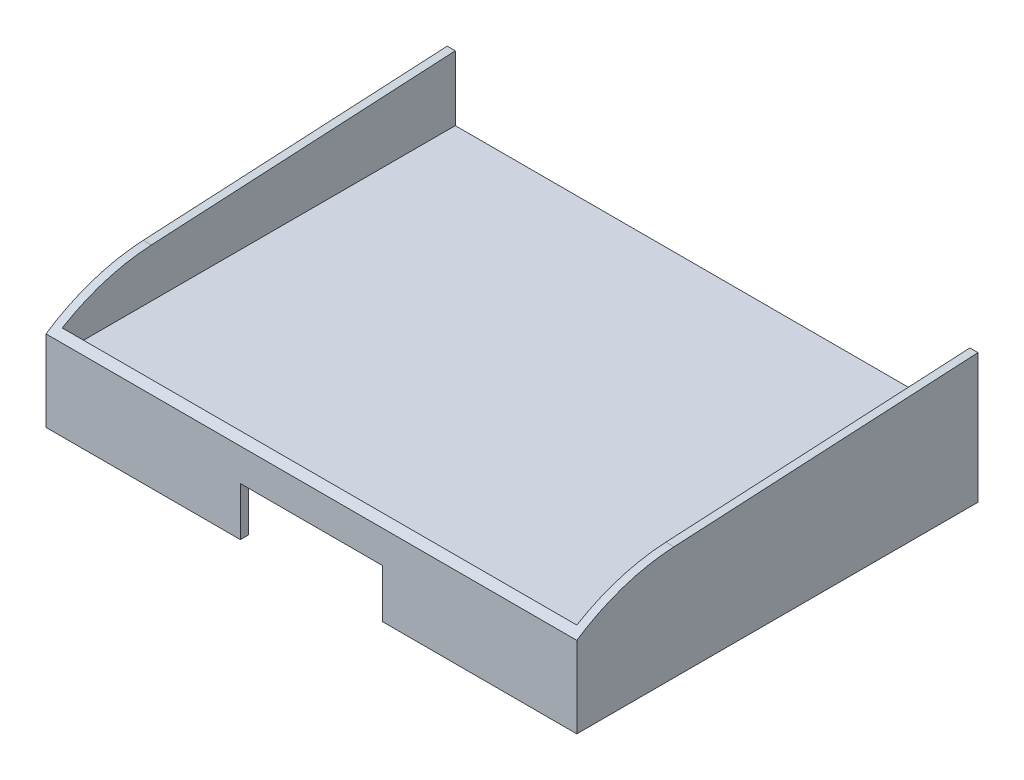
ISO-10303-21;
HEADER;
FILE_DESCRIPTION(('STEP AP214'),'2;1');
FILE_NAME('part.step','',(''),(''),'','','');
FILE_SCHEMA(('AUTOMOTIVE_DESIGN { 1 0 10303 214 1 1 1 1 }'));
ENDSEC;
DATA;
#1=APPLICATION_CONTEXT('core data for automotive mechanical design processes');
#2=APPLICATION_PROTOCOL_DEFINITION('international standard','automotive_design',2000,#1);
#3=PRODUCT_CONTEXT('',#1,'mechanical');
#4=PRODUCT('Part','Part','',(#3));
#5=PRODUCT_RELATED_PRODUCT_CATEGORY('part','',(#4));
#6=PRODUCT_DEFINITION_FORMATION('','',#4);
#7=PRODUCT_DEFINITION_CONTEXT('part definition',#1,'design');
#8=PRODUCT_DEFINITION('design','',#6,#7);
#9=PRODUCT_DEFINITION_SHAPE('','',#8);
#10=(LENGTH_UNIT() NAMED_UNIT(*) SI_UNIT(.MILLI.,.METRE.));
#11=(NAMED_UNIT(*) PLANE_ANGLE_UNIT() SI_UNIT($,.RADIAN.));
#12=(NAMED_UNIT(*) SI_UNIT($,.STERADIAN.) SOLID_ANGLE_UNIT());
#13=UNCERTAINTY_MEASURE_WITH_UNIT(LENGTH_MEASURE(1.E-05),#10,'distance_accuracy_value','');
#14=(GEOMETRIC_REPRESENTATION_CONTEXT(3) GLOBAL_UNCERTAINTY_ASSIGNED_CONTEXT((#13)) GLOBAL_UNIT_ASSIGNED_CONTEXT((#10,
#11,#12)) REPRESENTATION_CONTEXT('',''));
#15=CARTESIAN_POINT('',(0.,0.,0.));
#16=DIRECTION('',(0.,0.,1.));
#17=DIRECTION('',(1.,0.,0.));
#18=AXIS2_PLACEMENT_3D('',#15,#16,#17);
#19=CARTESIAN_POINT('',(242.216999999991,0.,135.763000000025));
#20=DIRECTION('',(1.,0.,0.));
#21=DIRECTION('',(0.,0.,-1.));
#22=AXIS2_PLACEMENT_3D('',#19,#20,#21);
#23=PLANE('',#22);
#24=DIRECTION('',(0.,0.,1.));
#25=VECTOR('',#24,1.);
#26=CARTESIAN_POINT('',(242.216999999991,38.1,-575.946873630957));
#27=LINE('',#26,#25);
#28=CARTESIAN_POINT('',(242.216999999991,38.1,-172.366999999975));
#29=VERTEX_POINT('',#28);
#30=CARTESIAN_POINT('',(242.216999999991,38.1,135.763000000025));
#31=VERTEX_POINT('',#30);
#32=EDGE_CURVE('E163',#29,#31,#27,.T.);
#33=ORIENTED_EDGE('',*,*,#32,.F.);
#34=DIRECTION('',(0.,1.,0.));
#35=VECTOR('',#34,1.);
#36=CARTESIAN_POINT('',(242.216999999991,0.,-172.366999999975));
#37=LINE('',#36,#35);
#38=CARTESIAN_POINT('',(242.216999999991,0.,-172.366999999975));
#39=VERTEX_POINT('',#38);
#40=EDGE_CURVE('E207',#39,#29,#37,.T.);
#41=ORIENTED_EDGE('',*,*,#40,.F.);
#42=DIRECTION('',(0.,0.,-1.));
#43=VECTOR('',#42,1.);
#44=CARTESIAN_POINT('',(242.216999999991,0.,135.763000000025));
#45=LINE('',#44,#43);
#46=CARTESIAN_POINT('',(242.216999999991,0.,135.763000000025));
#47=VERTEX_POINT('',#46);
#48=EDGE_CURVE('E188',#47,#39,#45,.T.);
#49=ORIENTED_EDGE('',*,*,#48,.F.);
#50=DIRECTION('',(0.,1.,0.));
#51=VECTOR('',#50,1.);
#52=CARTESIAN_POINT('',(242.216999999991,0.,135.763000000025));
#53=LINE('',#52,#51);
#54=EDGE_CURVE('E181',#47,#31,#53,.T.);
#55=ORIENTED_EDGE('',*,*,#54,.T.);
#56=EDGE_LOOP('',(#33,#41,#49,#55));
#57=FACE_BOUND('',#56,.T.);
#58=ADVANCED_FACE('F39',(#57),#23,.F.);
#59=DIRECTION('',(0.,0.,1.));
#60=VECTOR('',#59,1.);
#61=CARTESIAN_POINT('',(242.216999999991,50.8,-575.946873630957));
#62=LINE('',#61,#60);
#63=CARTESIAN_POINT('',(242.216999999991,50.8,-172.366999999975));
#64=VERTEX_POINT('',#63);
#65=CARTESIAN_POINT('',(242.216999999991,50.8,135.763000000025));
#66=VERTEX_POINT('',#65);
#67=EDGE_CURVE('E317',#64,#66,#62,.T.);
#68=ORIENTED_EDGE('',*,*,#67,.T.);
#69=CARTESIAN_POINT('',(242.216999999991,67.5291655997989,135.763000000025));
#70=VERTEX_POINT('',#69);
#71=EDGE_CURVE('E190',#66,#70,#53,.T.);
#72=ORIENTED_EDGE('',*,*,#71,.T.);
#73=CARTESIAN_POINT('',(242.216999999991,-62.2717454291141,57.8557515236538));
#74=DIRECTION('',(1.,0.,0.));
#75=DIRECTION('',(0.,0.,-1.));
#76=AXIS2_PLACEMENT_3D('',#73,#74,#75);
#77=CIRCLE('',#76,151.386313347987);
#78=CARTESIAN_POINT('',(242.216999999991,88.9,65.9130000000251));
#79=VERTEX_POINT('',#78);
#80=EDGE_CURVE('E285',#79,#70,#77,.T.);
#81=ORIENTED_EDGE('',*,*,#80,.F.);
#82=DIRECTION('',(0.,-0.0532230972416268,0.998582646514553));
#83=VECTOR('',#82,1.);
#84=CARTESIAN_POINT('',(242.216999999991,84.9358089989365,140.289963128641));
#85=LINE('',#84,#83);
#86=CARTESIAN_POINT('',(242.216999999991,101.6,-172.366999999975));
#87=VERTEX_POINT('',#86);
#88=EDGE_CURVE('E280',#87,#79,#85,.T.);
#89=ORIENTED_EDGE('',*,*,#88,.F.);
#90=EDGE_CURVE('E209',#64,#87,#37,.T.);
#91=ORIENTED_EDGE('',*,*,#90,.F.);
#92=EDGE_LOOP('',(#68,#72,#81,#89,#91));
#93=FACE_BOUND('',#92,.T.);
#94=ADVANCED_FACE('F304',(#93),#23,.F.);
#95=CARTESIAN_POINT('',(-161.163000000009,0.,135.763000000025));
#96=DIRECTION('',(0.,0.,1.));
#97=DIRECTION('',(1.,0.,0.));
#98=AXIS2_PLACEMENT_3D('',#95,#96,#97);
#99=PLANE('',#98);
#100=DIRECTION('',(-1.,0.,0.));
#101=VECTOR('',#100,1.);
#102=CARTESIAN_POINT('',(242.216999999991,38.1,135.763000000025));
#103=LINE('',#102,#101);
#104=CARTESIAN_POINT('',(96.166999999991,38.1,135.763000000025));
#105=VERTEX_POINT('',#104);
#106=EDGE_CURVE('E167',#31,#105,#103,.T.);
#107=ORIENTED_EDGE('',*,*,#106,.F.);
#108=ORIENTED_EDGE('',*,*,#54,.F.);
#109=DIRECTION('',(1.,0.,0.));
#110=VECTOR('',#109,1.);
#111=CARTESIAN_POINT('',(-161.163000000009,0.,135.763000000025));
#112=LINE('',#111,#110);
#113=CARTESIAN_POINT('',(96.166999999991,0.,135.763000000025));
#114=VERTEX_POINT('',#113);
#115=EDGE_CURVE('E289',#114,#47,#112,.T.);
#116=ORIENTED_EDGE('',*,*,#115,.F.);
#117=DIRECTION('',(0.,-1.,0.));
#118=VECTOR('',#117,1.);
#119=CARTESIAN_POINT('',(96.166999999991,0.,135.763000000025));
#120=LINE('',#119,#118);
#121=EDGE_CURVE('E183',#105,#114,#120,.T.);
#122=ORIENTED_EDGE('',*,*,#121,.F.);
#123=EDGE_LOOP('',(#107,#108,#116,#122));
#124=FACE_BOUND('',#123,.T.);
#125=ADVANCED_FACE('F179',(#124),#99,.F.);
#126=CARTESIAN_POINT('',(-15.1130000000088,38.1,135.763000000025));
#127=VERTEX_POINT('',#126);
#128=CARTESIAN_POINT('',(-161.163000000009,38.1,135.763000000025));
#129=VERTEX_POINT('',#128);
#130=EDGE_CURVE('E185',#127,#129,#103,.T.);
#131=ORIENTED_EDGE('',*,*,#130,.F.);
#132=DIRECTION('',(0.,1.,0.));
#133=VECTOR('',#132,1.);
#134=CARTESIAN_POINT('',(-15.1130000000088,0.,135.763000000025));
#135=LINE('',#134,#133);
#136=CARTESIAN_POINT('',(-15.1130000000088,0.,135.763000000025));
#137=VERTEX_POINT('',#136);
#138=EDGE_CURVE('E325',#137,#127,#135,.T.);
#139=ORIENTED_EDGE('',*,*,#138,.F.);
#140=CARTESIAN_POINT('',(-161.163000000009,0.,135.763000000025));
#141=VERTEX_POINT('',#140);
#142=EDGE_CURVE('E198',#141,#137,#112,.T.);
#143=ORIENTED_EDGE('',*,*,#142,.F.);
#144=DIRECTION('',(0.,1.,0.));
#145=VECTOR('',#144,1.);
#146=CARTESIAN_POINT('',(-161.163000000009,0.,135.763000000025));
#147=LINE('',#146,#145);
#148=EDGE_CURVE('E195',#141,#129,#147,.T.);
#149=ORIENTED_EDGE('',*,*,#148,.T.);
#150=EDGE_LOOP('',(#131,#139,#143,#149));
#151=FACE_BOUND('',#150,.T.);
#152=ADVANCED_FACE('F352',(#151),#99,.F.);
#153=DIRECTION('',(1.,0.,0.));
#154=VECTOR('',#153,1.);
#155=CARTESIAN_POINT('',(242.216999999991,50.8,135.763000000025));
#156=LINE('',#155,#154);
#157=CARTESIAN_POINT('',(-161.163000000009,50.8,135.763000000025));
#158=VERTEX_POINT('',#157);
#159=EDGE_CURVE('E184',#158,#66,#156,.T.);
#160=ORIENTED_EDGE('',*,*,#159,.F.);
#161=CARTESIAN_POINT('',(-161.163000000009,67.5291655997989,135.763000000025));
#162=VERTEX_POINT('',#161);
#163=EDGE_CURVE('E202',#158,#162,#147,.T.);
#164=ORIENTED_EDGE('',*,*,#163,.T.);
#165=DIRECTION('',(1.,0.,0.));
#166=VECTOR('',#165,1.);
#167=CARTESIAN_POINT('',(-167.513000000009,67.5291655997989,135.763000000025));
#168=LINE('',#167,#166);
#169=EDGE_CURVE('E282',#70,#162,#168,.F.);
#170=ORIENTED_EDGE('',*,*,#169,.F.);
#171=ORIENTED_EDGE('',*,*,#71,.F.);
#172=EDGE_LOOP('',(#160,#164,#170,#171));
#173=FACE_BOUND('',#172,.T.);
#174=ADVANCED_FACE('F311',(#173),#99,.F.);
#175=CARTESIAN_POINT('',(-161.163000000009,0.,135.763000000025));
#176=DIRECTION('',(-1.,0.,0.));
#177=DIRECTION('',(0.,0.,1.));
#178=AXIS2_PLACEMENT_3D('',#175,#176,#177);
#179=PLANE('',#178);
#180=DIRECTION('',(0.,0.,1.));
#181=VECTOR('',#180,1.);
#182=CARTESIAN_POINT('',(-161.163000000009,38.1,-575.946873630957));
#183=LINE('',#182,#181);
#184=CARTESIAN_POINT('',(-161.163000000009,38.1,-172.366999999975));
#185=VERTEX_POINT('',#184);
#186=EDGE_CURVE('E174',#185,#129,#183,.T.);
#187=ORIENTED_EDGE('',*,*,#186,.T.);
#188=ORIENTED_EDGE('',*,*,#148,.F.);
#189=DIRECTION('',(0.,0.,1.));
#190=VECTOR('',#189,1.);
#191=CARTESIAN_POINT('',(-161.163000000009,0.,135.763000000025));
#192=LINE('',#191,#190);
#193=CARTESIAN_POINT('',(-161.163000000009,0.,-172.366999999975));
#194=VERTEX_POINT('',#193);
#195=EDGE_CURVE('E288',#194,#141,#192,.T.);
#196=ORIENTED_EDGE('',*,*,#195,.F.);
#197=DIRECTION('',(0.,1.,0.));
#198=VECTOR('',#197,1.);
#199=CARTESIAN_POINT('',(-161.163000000009,0.,-172.366999999975));
#200=LINE('',#199,#198);
#201=EDGE_CURVE('E203',#194,#185,#200,.T.);
#202=ORIENTED_EDGE('',*,*,#201,.T.);
#203=EDGE_LOOP('',(#187,#188,#196,#202));
#204=FACE_BOUND('',#203,.T.);
#205=ADVANCED_FACE('F350',(#204),#179,.F.);
#206=DIRECTION('',(0.,0.,1.));
#207=VECTOR('',#206,1.);
#208=CARTESIAN_POINT('',(-161.163000000009,50.8,-575.946873630957));
#209=LINE('',#208,#207);
#210=CARTESIAN_POINT('',(-161.163000000009,50.8,-172.366999999975));
#211=VERTEX_POINT('',#210);
#212=EDGE_CURVE('E315',#211,#158,#209,.T.);
#213=ORIENTED_EDGE('',*,*,#212,.F.);
#214=CARTESIAN_POINT('',(-161.163000000009,101.6,-172.366999999975));
#215=VERTEX_POINT('',#214);
#216=EDGE_CURVE('E206',#211,#215,#200,.T.);
#217=ORIENTED_EDGE('',*,*,#216,.T.);
#218=DIRECTION('',(0.,0.0532230972416268,-0.998582646514553));
#219=VECTOR('',#218,1.);
#220=CARTESIAN_POINT('',(-161.163000000009,84.9358089989365,140.289963128641));
#221=LINE('',#220,#219);
#222=CARTESIAN_POINT('',(-161.163000000009,88.9,65.9130000000251));
#223=VERTEX_POINT('',#222);
#224=EDGE_CURVE('E47',#223,#215,#221,.T.);
#225=ORIENTED_EDGE('',*,*,#224,.F.);
#226=CARTESIAN_POINT('',(-161.163000000009,-62.2717454291141,57.8557515236538));
#227=DIRECTION('',(-1.,0.,0.));
#228=DIRECTION('',(0.,0.,1.));
#229=AXIS2_PLACEMENT_3D('',#226,#227,#228);
#230=CIRCLE('',#229,151.386313347987);
#231=EDGE_CURVE('E11',#162,#223,#230,.T.);
#232=ORIENTED_EDGE('',*,*,#231,.F.);
#233=ORIENTED_EDGE('',*,*,#163,.F.);
#234=EDGE_LOOP('',(#213,#217,#225,#232,#233));
#235=FACE_BOUND('',#234,.T.);
#236=ADVANCED_FACE('F314',(#235),#179,.F.);
#237=CARTESIAN_POINT('',(0.,0.,0.));
#238=DIRECTION('',(0.,-1.,0.));
#239=DIRECTION('',(0.,0.,-1.));
#240=AXIS2_PLACEMENT_3D('',#237,#238,#239);
#241=PLANE('',#240);
#242=DIRECTION('',(0.,0.,1.));
#243=VECTOR('',#242,1.);
#244=CARTESIAN_POINT('',(96.166999999991,0.,-172.367999999975));
#245=LINE('',#244,#243);
#246=CARTESIAN_POINT('',(96.166999999991,0.,142.113000000025));
#247=VERTEX_POINT('',#246);
#248=EDGE_CURVE('E276',#114,#247,#245,.T.);
#249=ORIENTED_EDGE('',*,*,#248,.F.);
#250=ORIENTED_EDGE('',*,*,#115,.T.);
#251=ORIENTED_EDGE('',*,*,#48,.T.);
#252=DIRECTION('',(-1.,0.,0.));
#253=VECTOR('',#252,1.);
#254=CARTESIAN_POINT('',(-167.513000000009,0.,-172.366999999975));
#255=LINE('',#254,#253);
#256=CARTESIAN_POINT('',(248.566999999991,0.,-172.366999999975));
#257=VERTEX_POINT('',#256);
#258=EDGE_CURVE('E221',#257,#39,#255,.T.);
#259=ORIENTED_EDGE('',*,*,#258,.F.);
#260=DIRECTION('',(0.,0.,-1.));
#261=VECTOR('',#260,1.);
#262=CARTESIAN_POINT('',(248.566999999991,0.,142.113000000025));
#263=LINE('',#262,#261);
#264=CARTESIAN_POINT('',(248.566999999991,0.,142.113000000025));
#265=VERTEX_POINT('',#264);
#266=EDGE_CURVE('E218',#265,#257,#263,.T.);
#267=ORIENTED_EDGE('',*,*,#266,.F.);
#268=DIRECTION('',(1.,0.,0.));
#269=VECTOR('',#268,1.);
#270=CARTESIAN_POINT('',(-167.513000000009,0.,142.113000000025));
#271=LINE('',#270,#269);
#272=EDGE_CURVE('E193',#247,#265,#271,.T.);
#273=ORIENTED_EDGE('',*,*,#272,.F.);
#274=EDGE_LOOP('',(#249,#250,#251,#259,#267,#273));
#275=FACE_BOUND('',#274,.T.);
#276=ADVANCED_FACE('F343',(#275),#241,.T.);
#277=CARTESIAN_POINT('',(-167.513000000009,101.6,142.113000000025));
#278=DIRECTION('',(1.,0.,0.));
#279=DIRECTION('',(0.,0.,-1.));
#280=AXIS2_PLACEMENT_3D('',#277,#278,#279);
#281=PLANE('',#280);
#282=CARTESIAN_POINT('',(-167.513000000009,-62.2717454291141,57.8557515236538));
#283=DIRECTION('',(1.,0.,0.));
#284=DIRECTION('',(0.,0.,-1.));
#285=AXIS2_PLACEMENT_3D('',#282,#283,#284);
#286=CIRCLE('',#285,151.386313347987);
#287=CARTESIAN_POINT('',(-167.513000000009,88.9,65.9130000000251));
#288=VERTEX_POINT('',#287);
#289=CARTESIAN_POINT('',(-167.513000000009,63.5,142.113000000025));
#290=VERTEX_POINT('',#289);
#291=EDGE_CURVE('E262',#288,#290,#286,.T.);
#292=ORIENTED_EDGE('',*,*,#291,.F.);
#293=DIRECTION('',(0.,-0.0532230972416268,0.998582646514553));
#294=VECTOR('',#293,1.);
#295=CARTESIAN_POINT('',(-167.513000000009,101.6,-172.366999999975));
#296=LINE('',#295,#294);
#297=CARTESIAN_POINT('',(-167.513000000009,101.6,-172.366999999975));
#298=VERTEX_POINT('',#297);
#299=EDGE_CURVE('E249',#298,#288,#296,.T.);
#300=ORIENTED_EDGE('',*,*,#299,.F.);
#301=DIRECTION('',(0.,-1.,0.));
#302=VECTOR('',#301,1.);
#303=CARTESIAN_POINT('',(-167.513000000009,101.6,-172.366999999975));
#304=LINE('',#303,#302);
#305=CARTESIAN_POINT('',(-167.513000000009,0.,-172.366999999975));
#306=VERTEX_POINT('',#305);
#307=EDGE_CURVE('E212',#298,#306,#304,.T.);
#308=ORIENTED_EDGE('',*,*,#307,.T.);
#309=DIRECTION('',(0.,0.,1.));
#310=VECTOR('',#309,1.);
#311=CARTESIAN_POINT('',(-167.513000000009,0.,142.113000000025));
#312=LINE('',#311,#310);
#313=CARTESIAN_POINT('',(-167.513000000009,0.,142.113000000025));
#314=VERTEX_POINT('',#313);
#315=EDGE_CURVE('E189',#306,#314,#312,.T.);
#316=ORIENTED_EDGE('',*,*,#315,.T.);
#317=DIRECTION('',(0.,-1.,0.));
#318=VECTOR('',#317,1.);
#319=CARTESIAN_POINT('',(-167.513000000009,101.6,142.113000000025));
#320=LINE('',#319,#318);
#321=EDGE_CURVE('E232',#290,#314,#320,.T.);
#322=ORIENTED_EDGE('',*,*,#321,.F.);
#323=EDGE_LOOP('',(#292,#300,#308,#316,#322));
#324=FACE_BOUND('',#323,.T.);
#325=ADVANCED_FACE('F41',(#324),#281,.F.);
#326=CARTESIAN_POINT('',(-167.513000000009,101.6,142.113000000025));
#327=DIRECTION('',(0.,0.,-1.));
#328=DIRECTION('',(-1.,0.,0.));
#329=AXIS2_PLACEMENT_3D('',#326,#327,#328);
#330=PLANE('',#329);
#331=DIRECTION('',(-1.,0.,0.));
#332=VECTOR('',#331,1.);
#333=CARTESIAN_POINT('',(96.166999999991,38.1,142.113000000025));
#334=LINE('',#333,#332);
#335=CARTESIAN_POINT('',(96.166999999991,38.1,142.113000000025));
#336=VERTEX_POINT('',#335);
#337=CARTESIAN_POINT('',(-15.1130000000088,38.1,142.113000000025));
#338=VERTEX_POINT('',#337);
#339=EDGE_CURVE('E332',#336,#338,#334,.T.);
#340=ORIENTED_EDGE('',*,*,#339,.F.);
#341=DIRECTION('',(0.,1.,0.));
#342=VECTOR('',#341,1.);
#343=CARTESIAN_POINT('',(96.166999999991,0.,142.113000000025));
#344=LINE('',#343,#342);
#345=EDGE_CURVE('E329',#247,#336,#344,.T.);
#346=ORIENTED_EDGE('',*,*,#345,.F.);
#347=ORIENTED_EDGE('',*,*,#272,.T.);
#348=DIRECTION('',(0.,-1.,0.));
#349=VECTOR('',#348,1.);
#350=CARTESIAN_POINT('',(248.566999999991,101.6,142.113000000025));
#351=LINE('',#350,#349);
#352=CARTESIAN_POINT('',(248.566999999991,63.5,142.113000000025));
#353=VERTEX_POINT('',#352);
#354=EDGE_CURVE('E229',#353,#265,#351,.T.);
#355=ORIENTED_EDGE('',*,*,#354,.F.);
#356=DIRECTION('',(1.,0.,0.));
#357=VECTOR('',#356,1.);
#358=CARTESIAN_POINT('',(-167.513000000009,63.5,142.113000000025));
#359=LINE('',#358,#357);
#360=EDGE_CURVE('E261',#290,#353,#359,.T.);
#361=ORIENTED_EDGE('',*,*,#360,.F.);
#362=ORIENTED_EDGE('',*,*,#321,.T.);
#363=CARTESIAN_POINT('',(-15.1130000000088,0.,142.113000000025));
#364=VERTEX_POINT('',#363);
#365=EDGE_CURVE('E215',#314,#364,#271,.T.);
#366=ORIENTED_EDGE('',*,*,#365,.T.);
#367=DIRECTION('',(0.,-1.,0.));
#368=VECTOR('',#367,1.);
#369=CARTESIAN_POINT('',(-15.1130000000088,0.,142.113000000025));
#370=LINE('',#369,#368);
#371=EDGE_CURVE('E54',#338,#364,#370,.T.);
#372=ORIENTED_EDGE('',*,*,#371,.F.);
#373=EDGE_LOOP('',(#340,#346,#347,#355,#361,#362,#366,#372));
#374=FACE_BOUND('',#373,.T.);
#375=ADVANCED_FACE('F258',(#374),#330,.F.);
#376=CARTESIAN_POINT('',(248.566999999991,101.6,142.113000000025));
#377=DIRECTION('',(-1.,0.,0.));
#378=DIRECTION('',(0.,0.,1.));
#379=AXIS2_PLACEMENT_3D('',#376,#377,#378);
#380=PLANE('',#379);
#381=CARTESIAN_POINT('',(248.566999999991,-62.2717454291141,57.8557515236538));
#382=DIRECTION('',(1.,0.,0.));
#383=DIRECTION('',(0.,0.,-1.));
#384=AXIS2_PLACEMENT_3D('',#381,#382,#383);
#385=CIRCLE('',#384,151.386313347987);
#386=CARTESIAN_POINT('',(248.566999999991,88.9,65.9130000000251));
#387=VERTEX_POINT('',#386);
#388=EDGE_CURVE('E269',#387,#353,#385,.T.);
#389=ORIENTED_EDGE('',*,*,#388,.T.);
#390=ORIENTED_EDGE('',*,*,#354,.T.);
#391=ORIENTED_EDGE('',*,*,#266,.T.);
#392=DIRECTION('',(0.,-1.,0.));
#393=VECTOR('',#392,1.);
#394=CARTESIAN_POINT('',(248.566999999991,101.6,-172.366999999975));
#395=LINE('',#394,#393);
#396=CARTESIAN_POINT('',(248.566999999991,101.6,-172.366999999975));
#397=VERTEX_POINT('',#396);
#398=EDGE_CURVE('E226',#397,#257,#395,.T.);
#399=ORIENTED_EDGE('',*,*,#398,.F.);
#400=DIRECTION('',(0.,-0.0532230972416268,0.998582646514553));
#401=VECTOR('',#400,1.);
#402=CARTESIAN_POINT('',(248.566999999991,101.6,-172.366999999975));
#403=LINE('',#402,#401);
#404=EDGE_CURVE('E264',#397,#387,#403,.T.);
#405=ORIENTED_EDGE('',*,*,#404,.T.);
#406=EDGE_LOOP('',(#389,#390,#391,#399,#405));
#407=FACE_BOUND('',#406,.T.);
#408=ADVANCED_FACE('F346',(#407),#380,.F.);
#409=CARTESIAN_POINT('',(-167.513000000009,101.6,-172.366999999975));
#410=DIRECTION('',(0.,0.,1.));
#411=DIRECTION('',(1.,0.,0.));
#412=AXIS2_PLACEMENT_3D('',#409,#410,#411);
#413=PLANE('',#412);
#414=DIRECTION('',(-1.,0.,0.));
#415=VECTOR('',#414,1.);
#416=CARTESIAN_POINT('',(-167.513000000009,101.6,-172.366999999975));
#417=LINE('',#416,#415);
#418=EDGE_CURVE('E213',#215,#298,#417,.T.);
#419=ORIENTED_EDGE('',*,*,#418,.F.);
#420=ORIENTED_EDGE('',*,*,#216,.F.);
#421=DIRECTION('',(1.,0.,0.));
#422=VECTOR('',#421,1.);
#423=CARTESIAN_POINT('',(242.216999999991,50.8,-172.366999999975));
#424=LINE('',#423,#422);
#425=EDGE_CURVE('E294',#211,#64,#424,.T.);
#426=ORIENTED_EDGE('',*,*,#425,.T.);
#427=ORIENTED_EDGE('',*,*,#90,.T.);
#428=EDGE_CURVE('E210',#397,#87,#417,.T.);
#429=ORIENTED_EDGE('',*,*,#428,.F.);
#430=ORIENTED_EDGE('',*,*,#398,.T.);
#431=ORIENTED_EDGE('',*,*,#258,.T.);
#432=ORIENTED_EDGE('',*,*,#40,.T.);
#433=DIRECTION('',(-1.,0.,0.));
#434=VECTOR('',#433,1.);
#435=CARTESIAN_POINT('',(242.216999999991,38.1,-172.366999999975));
#436=LINE('',#435,#434);
#437=EDGE_CURVE('E170',#29,#185,#436,.T.);
#438=ORIENTED_EDGE('',*,*,#437,.T.);
#439=ORIENTED_EDGE('',*,*,#201,.F.);
#440=EDGE_CURVE('E220',#194,#306,#255,.T.);
#441=ORIENTED_EDGE('',*,*,#440,.T.);
#442=ORIENTED_EDGE('',*,*,#307,.F.);
#443=EDGE_LOOP('',(#419,#420,#426,#427,#429,#430,#431,#432,#438,#439,#441,#442));
#444=FACE_BOUND('',#443,.T.);
#445=ADVANCED_FACE('F242',(#444),#413,.F.);
#446=DIRECTION('',(0.,0.,1.));
#447=VECTOR('',#446,1.);
#448=CARTESIAN_POINT('',(-15.1130000000088,0.,-172.367999999975));
#449=LINE('',#448,#447);
#450=EDGE_CURVE('E255',#137,#364,#449,.T.);
#451=ORIENTED_EDGE('',*,*,#450,.T.);
#452=ORIENTED_EDGE('',*,*,#365,.F.);
#453=ORIENTED_EDGE('',*,*,#315,.F.);
#454=ORIENTED_EDGE('',*,*,#440,.F.);
#455=ORIENTED_EDGE('',*,*,#195,.T.);
#456=ORIENTED_EDGE('',*,*,#142,.T.);
#457=EDGE_LOOP('',(#451,#452,#453,#454,#455,#456));
#458=FACE_BOUND('',#457,.T.);
#459=ADVANCED_FACE('F252',(#458),#241,.T.);
#460=CARTESIAN_POINT('',(-167.513000000009,-62.2717454291141,57.8557515236538));
#461=DIRECTION('',(1.,0.,0.));
#462=DIRECTION('',(0.,0.,-1.));
#463=AXIS2_PLACEMENT_3D('',#460,#461,#462);
#464=CYLINDRICAL_SURFACE('',#463,151.386313347987);
#465=ORIENTED_EDGE('',*,*,#80,.T.);
#466=ORIENTED_EDGE('',*,*,#169,.T.);
#467=ORIENTED_EDGE('',*,*,#231,.T.);
#468=DIRECTION('',(1.,0.,0.));
#469=VECTOR('',#468,1.);
#470=CARTESIAN_POINT('',(-167.513000000009,88.9,65.9130000000251));
#471=LINE('',#470,#469);
#472=EDGE_CURVE('E62',#288,#223,#471,.T.);
#473=ORIENTED_EDGE('',*,*,#472,.F.);
#474=ORIENTED_EDGE('',*,*,#291,.T.);
#475=ORIENTED_EDGE('',*,*,#360,.T.);
#476=ORIENTED_EDGE('',*,*,#388,.F.);
#477=EDGE_CURVE('E266',#79,#387,#471,.T.);
#478=ORIENTED_EDGE('',*,*,#477,.F.);
#479=EDGE_LOOP('',(#465,#466,#467,#473,#474,#475,#476,#478));
#480=FACE_BOUND('',#479,.T.);
#481=ADVANCED_FACE('F307',(#480),#464,.T.);
#482=CARTESIAN_POINT('',(-167.513000000009,101.6,-172.366999999975));
#483=DIRECTION('',(0.,0.998582646514553,0.0532230972416268));
#484=DIRECTION('',(0.,-0.0532230972416268,0.998582646514553));
#485=AXIS2_PLACEMENT_3D('',#482,#483,#484);
#486=PLANE('',#485);
#487=ORIENTED_EDGE('',*,*,#88,.T.);
#488=ORIENTED_EDGE('',*,*,#477,.T.);
#489=ORIENTED_EDGE('',*,*,#404,.F.);
#490=ORIENTED_EDGE('',*,*,#428,.T.);
#491=EDGE_LOOP('',(#487,#488,#489,#490));
#492=FACE_BOUND('',#491,.T.);
#493=ADVANCED_FACE('F300',(#492),#486,.T.);
#494=ORIENTED_EDGE('',*,*,#224,.T.);
#495=ORIENTED_EDGE('',*,*,#418,.T.);
#496=ORIENTED_EDGE('',*,*,#299,.T.);
#497=ORIENTED_EDGE('',*,*,#472,.T.);
#498=EDGE_LOOP('',(#494,#495,#496,#497));
#499=FACE_BOUND('',#498,.T.);
#500=ADVANCED_FACE('F235',(#499),#486,.T.);
#501=CARTESIAN_POINT('',(96.166999999991,0.,-172.367999999975));
#502=DIRECTION('',(1.,0.,0.));
#503=DIRECTION('',(0.,1.,0.));
#504=AXIS2_PLACEMENT_3D('',#501,#502,#503);
#505=PLANE('',#504);
#506=ORIENTED_EDGE('',*,*,#121,.T.);
#507=ORIENTED_EDGE('',*,*,#248,.T.);
#508=ORIENTED_EDGE('',*,*,#345,.T.);
#509=DIRECTION('',(0.,0.,1.));
#510=VECTOR('',#509,1.);
#511=CARTESIAN_POINT('',(96.166999999991,38.1,-172.367999999975));
#512=LINE('',#511,#510);
#513=EDGE_CURVE('E272',#105,#336,#512,.T.);
#514=ORIENTED_EDGE('',*,*,#513,.F.);
#515=EDGE_LOOP('',(#506,#507,#508,#514));
#516=FACE_BOUND('',#515,.T.);
#517=ADVANCED_FACE('F340',(#516),#505,.F.);
#518=CARTESIAN_POINT('',(-15.1130000000088,0.,-172.367999999975));
#519=DIRECTION('',(-1.,0.,0.));
#520=DIRECTION('',(0.,0.,1.));
#521=AXIS2_PLACEMENT_3D('',#518,#519,#520);
#522=PLANE('',#521);
#523=ORIENTED_EDGE('',*,*,#138,.T.);
#524=DIRECTION('',(0.,0.,1.));
#525=VECTOR('',#524,1.);
#526=CARTESIAN_POINT('',(-15.1130000000088,38.1,-172.367999999975));
#527=LINE('',#526,#525);
#528=EDGE_CURVE('E337',#127,#338,#527,.T.);
#529=ORIENTED_EDGE('',*,*,#528,.T.);
#530=ORIENTED_EDGE('',*,*,#371,.T.);
#531=ORIENTED_EDGE('',*,*,#450,.F.);
#532=EDGE_LOOP('',(#523,#529,#530,#531));
#533=FACE_BOUND('',#532,.T.);
#534=ADVANCED_FACE('F354',(#533),#522,.F.);
#535=CARTESIAN_POINT('',(96.166999999991,38.1,-172.367999999975));
#536=DIRECTION('',(0.,1.,0.));
#537=DIRECTION('',(-1.,0.,0.));
#538=AXIS2_PLACEMENT_3D('',#535,#536,#537);
#539=PLANE('',#538);
#540=ORIENTED_EDGE('',*,*,#528,.F.);
#541=ORIENTED_EDGE('',*,*,#130,.T.);
#542=ORIENTED_EDGE('',*,*,#186,.F.);
#543=ORIENTED_EDGE('',*,*,#437,.F.);
#544=ORIENTED_EDGE('',*,*,#32,.T.);
#545=ORIENTED_EDGE('',*,*,#106,.T.);
#546=ORIENTED_EDGE('',*,*,#513,.T.);
#547=ORIENTED_EDGE('',*,*,#339,.T.);
#548=EDGE_LOOP('',(#540,#541,#542,#543,#544,#545,#546,#547));
#549=FACE_BOUND('',#548,.T.);
#550=ADVANCED_FACE('F166',(#549),#539,.F.);
#551=CARTESIAN_POINT('',(242.216999999991,50.8,-575.946873630957));
#552=DIRECTION('',(0.,-1.,0.));
#553=DIRECTION('',(0.,0.,-1.));
#554=AXIS2_PLACEMENT_3D('',#551,#552,#553);
#555=PLANE('',#554);
#556=ORIENTED_EDGE('',*,*,#425,.F.);
#557=ORIENTED_EDGE('',*,*,#212,.T.);
#558=ORIENTED_EDGE('',*,*,#159,.T.);
#559=ORIENTED_EDGE('',*,*,#67,.F.);
#560=EDGE_LOOP('',(#556,#557,#558,#559));
#561=FACE_BOUND('',#560,.T.);
#562=ADVANCED_FACE('F361',(#561),#555,.F.);
#563=CLOSED_SHELL('',(#58,#94,#125,#152,#174,#205,#236,#276,#325,#375,#408,#445,#459,#481,#493,
#500,#517,#534,#550,#562));
#564=MANIFOLD_SOLID_BREP('B2',#563);
#565=ADVANCED_BREP_SHAPE_REPRESENTATION('',(#18,#564),#14);
#566=SHAPE_DEFINITION_REPRESENTATION(#9,#565);
ENDSEC;
END-ISO-10303-21;
